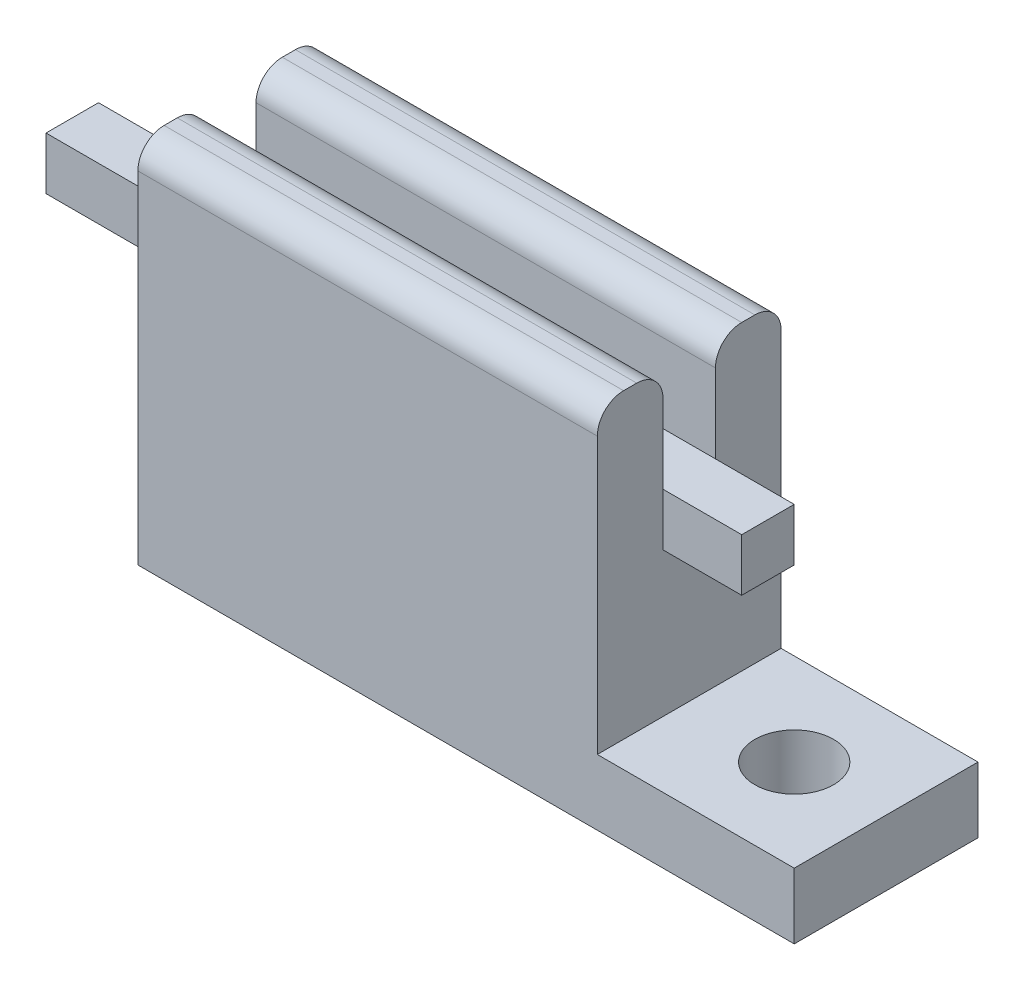
ISO-10303-21;
HEADER;
FILE_DESCRIPTION(('STEP AP214'),'2;1');
FILE_NAME('part.step','',(''),(''),'','','');
FILE_SCHEMA(('AUTOMOTIVE_DESIGN { 1 0 10303 214 1 1 1 1 }'));
ENDSEC;
DATA;
#1=APPLICATION_CONTEXT('core data for automotive mechanical design processes');
#2=APPLICATION_PROTOCOL_DEFINITION('international standard','automotive_design',2000,#1);
#3=PRODUCT_CONTEXT('',#1,'mechanical');
#4=PRODUCT('Part','Part','',(#3));
#5=PRODUCT_RELATED_PRODUCT_CATEGORY('part','',(#4));
#6=PRODUCT_DEFINITION_FORMATION('','',#4);
#7=PRODUCT_DEFINITION_CONTEXT('part definition',#1,'design');
#8=PRODUCT_DEFINITION('design','',#6,#7);
#9=PRODUCT_DEFINITION_SHAPE('','',#8);
#10=(LENGTH_UNIT() NAMED_UNIT(*) SI_UNIT(.MILLI.,.METRE.));
#11=(NAMED_UNIT(*) PLANE_ANGLE_UNIT() SI_UNIT($,.RADIAN.));
#12=(NAMED_UNIT(*) SI_UNIT($,.STERADIAN.) SOLID_ANGLE_UNIT());
#13=UNCERTAINTY_MEASURE_WITH_UNIT(LENGTH_MEASURE(1.E-05),#10,'distance_accuracy_value','');
#14=(GEOMETRIC_REPRESENTATION_CONTEXT(3) GLOBAL_UNCERTAINTY_ASSIGNED_CONTEXT((#13)) GLOBAL_UNIT_ASSIGNED_CONTEXT((#10,
#11,#12)) REPRESENTATION_CONTEXT('',''));
#15=CARTESIAN_POINT('',(0.,0.,0.));
#16=DIRECTION('',(0.,0.,1.));
#17=DIRECTION('',(1.,0.,0.));
#18=AXIS2_PLACEMENT_3D('',#15,#16,#17);
#19=CARTESIAN_POINT('',(-43.,5.,-6.99999999999999));
#20=DIRECTION('',(1.,0.,0.));
#21=DIRECTION('',(0.,0.,-1.));
#22=AXIS2_PLACEMENT_3D('',#19,#20,#21);
#23=PLANE('',#22);
#24=DIRECTION('',(0.,-1.,0.));
#25=VECTOR('',#24,1.);
#26=CARTESIAN_POINT('',(-43.,5.,7.));
#27=LINE('',#26,#25);
#28=CARTESIAN_POINT('',(-43.,26.,7.));
#29=VERTEX_POINT('',#28);
#30=CARTESIAN_POINT('',(-43.,0.,7.));
#31=VERTEX_POINT('',#30);
#32=EDGE_CURVE('E292',#29,#31,#27,.T.);
#33=ORIENTED_EDGE('',*,*,#32,.F.);
#34=CARTESIAN_POINT('',(-43.,26.,5.));
#35=DIRECTION('',(1.,0.,0.));
#36=DIRECTION('',(0.,0.,-1.));
#37=AXIS2_PLACEMENT_3D('',#34,#35,#36);
#38=CIRCLE('',#37,2.);
#39=CARTESIAN_POINT('',(-43.,28.,5.));
#40=VERTEX_POINT('',#39);
#41=EDGE_CURVE('E331',#29,#40,#38,.F.);
#42=ORIENTED_EDGE('',*,*,#41,.T.);
#43=DIRECTION('',(0.,0.,1.));
#44=VECTOR('',#43,1.);
#45=CARTESIAN_POINT('',(-43.,28.,7.));
#46=LINE('',#45,#44);
#47=CARTESIAN_POINT('',(-43.,28.,4.));
#48=VERTEX_POINT('',#47);
#49=EDGE_CURVE('E261',#48,#40,#46,.T.);
#50=ORIENTED_EDGE('',*,*,#49,.F.);
#51=CARTESIAN_POINT('',(-43.,26.,4.));
#52=DIRECTION('',(1.,0.,0.));
#53=DIRECTION('',(0.,0.,-1.));
#54=AXIS2_PLACEMENT_3D('',#51,#52,#53);
#55=CIRCLE('',#54,2.);
#56=CARTESIAN_POINT('',(-43.,26.,2.));
#57=VERTEX_POINT('',#56);
#58=EDGE_CURVE('E50',#48,#57,#55,.F.);
#59=ORIENTED_EDGE('',*,*,#58,.T.);
#60=DIRECTION('',(0.,-1.,0.));
#61=VECTOR('',#60,1.);
#62=CARTESIAN_POINT('',(-43.,28.,2.));
#63=LINE('',#62,#61);
#64=CARTESIAN_POINT('',(-43.,20.,2.));
#65=VERTEX_POINT('',#64);
#66=EDGE_CURVE('E264',#57,#65,#63,.T.);
#67=ORIENTED_EDGE('',*,*,#66,.T.);
#68=DIRECTION('',(0.,1.,0.));
#69=VECTOR('',#68,1.);
#70=CARTESIAN_POINT('',(-43.,16.,2.));
#71=LINE('',#70,#69);
#72=CARTESIAN_POINT('',(-43.,16.,2.));
#73=VERTEX_POINT('',#72);
#74=EDGE_CURVE('E235',#73,#65,#71,.T.);
#75=ORIENTED_EDGE('',*,*,#74,.F.);
#76=DIRECTION('',(0.,0.,-1.));
#77=VECTOR('',#76,1.);
#78=CARTESIAN_POINT('',(-43.,16.,2.));
#79=LINE('',#78,#77);
#80=CARTESIAN_POINT('',(-43.,16.,-1.99999999999999));
#81=VERTEX_POINT('',#80);
#82=EDGE_CURVE('E214',#73,#81,#79,.T.);
#83=ORIENTED_EDGE('',*,*,#82,.T.);
#84=DIRECTION('',(0.,1.,0.));
#85=VECTOR('',#84,1.);
#86=CARTESIAN_POINT('',(-43.,16.,-1.99999999999999));
#87=LINE('',#86,#85);
#88=CARTESIAN_POINT('',(-43.,20.,-1.99999999999999));
#89=VERTEX_POINT('',#88);
#90=EDGE_CURVE('E227',#81,#89,#87,.T.);
#91=ORIENTED_EDGE('',*,*,#90,.T.);
#92=DIRECTION('',(0.,-1.,0.));
#93=VECTOR('',#92,1.);
#94=CARTESIAN_POINT('',(-43.,28.,-1.99999999999999));
#95=LINE('',#94,#93);
#96=CARTESIAN_POINT('',(-43.,26.,-1.99999999999999));
#97=VERTEX_POINT('',#96);
#98=EDGE_CURVE('E255',#97,#89,#95,.T.);
#99=ORIENTED_EDGE('',*,*,#98,.F.);
#100=CARTESIAN_POINT('',(-43.,26.,-3.99999999999999));
#101=DIRECTION('',(1.,0.,0.));
#102=DIRECTION('',(0.,0.,-1.));
#103=AXIS2_PLACEMENT_3D('',#100,#101,#102);
#104=CIRCLE('',#103,2.);
#105=CARTESIAN_POINT('',(-43.,28.,-3.99999999999999));
#106=VERTEX_POINT('',#105);
#107=EDGE_CURVE('E329',#97,#106,#104,.F.);
#108=ORIENTED_EDGE('',*,*,#107,.T.);
#109=DIRECTION('',(0.,0.,1.));
#110=VECTOR('',#109,1.);
#111=CARTESIAN_POINT('',(-43.,28.,-6.99999999999999));
#112=LINE('',#111,#110);
#113=CARTESIAN_POINT('',(-43.,28.,-4.99999999999999));
#114=VERTEX_POINT('',#113);
#115=EDGE_CURVE('E245',#114,#106,#112,.T.);
#116=ORIENTED_EDGE('',*,*,#115,.F.);
#117=CARTESIAN_POINT('',(-43.,26.,-4.99999999999999));
#118=DIRECTION('',(1.,0.,0.));
#119=DIRECTION('',(0.,0.,-1.));
#120=AXIS2_PLACEMENT_3D('',#117,#118,#119);
#121=CIRCLE('',#120,2.);
#122=CARTESIAN_POINT('',(-43.,26.,-6.99999999999999));
#123=VERTEX_POINT('',#122);
#124=EDGE_CURVE('E57',#114,#123,#121,.F.);
#125=ORIENTED_EDGE('',*,*,#124,.T.);
#126=DIRECTION('',(0.,-1.,0.));
#127=VECTOR('',#126,1.);
#128=CARTESIAN_POINT('',(-43.,5.,-6.99999999999999));
#129=LINE('',#128,#127);
#130=CARTESIAN_POINT('',(-43.,0.,-6.99999999999999));
#131=VERTEX_POINT('',#130);
#132=EDGE_CURVE('E303',#123,#131,#129,.T.);
#133=ORIENTED_EDGE('',*,*,#132,.T.);
#134=DIRECTION('',(0.,0.,1.));
#135=VECTOR('',#134,1.);
#136=CARTESIAN_POINT('',(-43.,0.,-6.99999999999999));
#137=LINE('',#136,#135);
#138=EDGE_CURVE('E287',#131,#31,#137,.T.);
#139=ORIENTED_EDGE('',*,*,#138,.T.);
#140=EDGE_LOOP('',(#33,#42,#50,#59,#67,#75,#83,#91,#99,#108,#116,#125,#133,#139));
#141=FACE_BOUND('',#140,.T.);
#142=ADVANCED_FACE('F35',(#141),#23,.F.);
#143=CARTESIAN_POINT('',(0.,20.,0.));
#144=DIRECTION('',(0.,1.,0.));
#145=DIRECTION('',(0.,0.,1.));
#146=AXIS2_PLACEMENT_3D('',#143,#144,#145);
#147=PLANE('',#146);
#148=DIRECTION('',(-1.,0.,0.));
#149=VECTOR('',#148,1.);
#150=CARTESIAN_POINT('',(-43.,20.,2.));
#151=LINE('',#150,#149);
#152=CARTESIAN_POINT('',(-8.,20.,2.));
#153=VERTEX_POINT('',#152);
#154=EDGE_CURVE('E257',#153,#65,#151,.T.);
#155=ORIENTED_EDGE('',*,*,#154,.F.);
#156=DIRECTION('',(1.,0.,0.));
#157=VECTOR('',#156,1.);
#158=CARTESIAN_POINT('',(-2.,20.,2.));
#159=LINE('',#158,#157);
#160=CARTESIAN_POINT('',(-2.,20.,2.));
#161=VERTEX_POINT('',#160);
#162=EDGE_CURVE('E176',#153,#161,#159,.T.);
#163=ORIENTED_EDGE('',*,*,#162,.T.);
#164=DIRECTION('',(0.,0.,-1.));
#165=VECTOR('',#164,1.);
#166=CARTESIAN_POINT('',(-2.,20.,-1.99999999999999));
#167=LINE('',#166,#165);
#168=CARTESIAN_POINT('',(-2.,20.,-1.99999999999999));
#169=VERTEX_POINT('',#168);
#170=EDGE_CURVE('E201',#161,#169,#167,.T.);
#171=ORIENTED_EDGE('',*,*,#170,.T.);
#172=DIRECTION('',(-1.,0.,0.));
#173=VECTOR('',#172,1.);
#174=CARTESIAN_POINT('',(-8.,20.,-1.99999999999999));
#175=LINE('',#174,#173);
#176=CARTESIAN_POINT('',(-8.,20.,-1.99999999999999));
#177=VERTEX_POINT('',#176);
#178=EDGE_CURVE('E198',#169,#177,#175,.T.);
#179=ORIENTED_EDGE('',*,*,#178,.T.);
#180=DIRECTION('',(1.,0.,0.));
#181=VECTOR('',#180,1.);
#182=CARTESIAN_POINT('',(-43.,20.,-1.99999999999999));
#183=LINE('',#182,#181);
#184=EDGE_CURVE('E238',#89,#177,#183,.T.);
#185=ORIENTED_EDGE('',*,*,#184,.F.);
#186=DIRECTION('',(-1.,0.,0.));
#187=VECTOR('',#186,1.);
#188=CARTESIAN_POINT('',(-43.,20.,-1.99999999999999));
#189=LINE('',#188,#187);
#190=CARTESIAN_POINT('',(-55.,20.,-1.99999999999999));
#191=VERTEX_POINT('',#190);
#192=EDGE_CURVE('E210',#89,#191,#189,.T.);
#193=ORIENTED_EDGE('',*,*,#192,.T.);
#194=DIRECTION('',(0.,0.,1.));
#195=VECTOR('',#194,1.);
#196=CARTESIAN_POINT('',(-55.,20.,-1.99999999999999));
#197=LINE('',#196,#195);
#198=CARTESIAN_POINT('',(-55.,20.,2.));
#199=VERTEX_POINT('',#198);
#200=EDGE_CURVE('E230',#191,#199,#197,.T.);
#201=ORIENTED_EDGE('',*,*,#200,.T.);
#202=DIRECTION('',(1.,0.,0.));
#203=VECTOR('',#202,1.);
#204=CARTESIAN_POINT('',(-55.,20.,2.));
#205=LINE('',#204,#203);
#206=EDGE_CURVE('E218',#199,#65,#205,.T.);
#207=ORIENTED_EDGE('',*,*,#206,.T.);
#208=EDGE_LOOP('',(#155,#163,#171,#179,#185,#193,#201,#207));
#209=FACE_BOUND('',#208,.T.);
#210=ADVANCED_FACE('F366',(#209),#147,.T.);
#211=CARTESIAN_POINT('',(0.,5.,0.));
#212=DIRECTION('',(0.,1.,0.));
#213=DIRECTION('',(0.,0.,1.));
#214=AXIS2_PLACEMENT_3D('',#211,#212,#213);
#215=PLANE('',#214);
#216=DIRECTION('',(0.,0.,-1.));
#217=VECTOR('',#216,1.);
#218=CARTESIAN_POINT('',(-8.,5.,7.));
#219=LINE('',#218,#217);
#220=CARTESIAN_POINT('',(-8.,5.,7.));
#221=VERTEX_POINT('',#220);
#222=CARTESIAN_POINT('',(-8.,5.,-7.));
#223=VERTEX_POINT('',#222);
#224=EDGE_CURVE('E270',#221,#223,#219,.T.);
#225=ORIENTED_EDGE('',*,*,#224,.F.);
#226=DIRECTION('',(1.,0.,0.));
#227=VECTOR('',#226,1.);
#228=CARTESIAN_POINT('',(-43.,5.,7.));
#229=LINE('',#228,#227);
#230=CARTESIAN_POINT('',(7.,5.,7.));
#231=VERTEX_POINT('',#230);
#232=EDGE_CURVE('E284',#221,#231,#229,.T.);
#233=ORIENTED_EDGE('',*,*,#232,.T.);
#234=DIRECTION('',(0.,0.,-1.));
#235=VECTOR('',#234,1.);
#236=CARTESIAN_POINT('',(7.,5.,7.));
#237=LINE('',#236,#235);
#238=CARTESIAN_POINT('',(7.,5.,-7.));
#239=VERTEX_POINT('',#238);
#240=EDGE_CURVE('E286',#231,#239,#237,.T.);
#241=ORIENTED_EDGE('',*,*,#240,.T.);
#242=DIRECTION('',(-1.,0.,0.));
#243=VECTOR('',#242,1.);
#244=CARTESIAN_POINT('',(7.,5.,-7.));
#245=LINE('',#244,#243);
#246=EDGE_CURVE('E289',#239,#223,#245,.T.);
#247=ORIENTED_EDGE('',*,*,#246,.T.);
#248=EDGE_LOOP('',(#225,#233,#241,#247));
#249=FACE_BOUND('',#248,.T.);
#250=CARTESIAN_POINT('',(0.,5.,0.));
#251=DIRECTION('',(0.,1.,0.));
#252=DIRECTION('',(0.,0.,1.));
#253=AXIS2_PLACEMENT_3D('',#250,#251,#252);
#254=CIRCLE('',#253,3.);
#255=CARTESIAN_POINT('',(0.,5.,3.));
#256=VERTEX_POINT('',#255);
#257=EDGE_CURVE('E278',#256,#256,#254,.T.);
#258=ORIENTED_EDGE('',*,*,#257,.F.);
#259=EDGE_LOOP('',(#258));
#260=FACE_BOUND('',#259,.T.);
#261=ADVANCED_FACE('F394',(#249,#260),#215,.T.);
#262=CARTESIAN_POINT('',(0.,0.,0.));
#263=DIRECTION('',(0.,1.,0.));
#264=DIRECTION('',(0.,0.,1.));
#265=AXIS2_PLACEMENT_3D('',#262,#263,#264);
#266=PLANE('',#265);
#267=DIRECTION('',(1.,0.,0.));
#268=VECTOR('',#267,1.);
#269=CARTESIAN_POINT('',(-43.,0.,7.));
#270=LINE('',#269,#268);
#271=CARTESIAN_POINT('',(7.,0.,7.));
#272=VERTEX_POINT('',#271);
#273=EDGE_CURVE('E281',#31,#272,#270,.T.);
#274=ORIENTED_EDGE('',*,*,#273,.F.);
#275=ORIENTED_EDGE('',*,*,#138,.F.);
#276=DIRECTION('',(-1.,0.,0.));
#277=VECTOR('',#276,1.);
#278=CARTESIAN_POINT('',(7.,0.,-7.));
#279=LINE('',#278,#277);
#280=CARTESIAN_POINT('',(7.,0.,-7.));
#281=VERTEX_POINT('',#280);
#282=EDGE_CURVE('E297',#281,#131,#279,.T.);
#283=ORIENTED_EDGE('',*,*,#282,.F.);
#284=DIRECTION('',(0.,0.,-1.));
#285=VECTOR('',#284,1.);
#286=CARTESIAN_POINT('',(7.,0.,7.));
#287=LINE('',#286,#285);
#288=EDGE_CURVE('E295',#272,#281,#287,.T.);
#289=ORIENTED_EDGE('',*,*,#288,.F.);
#290=EDGE_LOOP('',(#274,#275,#283,#289));
#291=FACE_BOUND('',#290,.T.);
#292=CARTESIAN_POINT('',(0.,0.,0.));
#293=DIRECTION('',(0.,1.,0.));
#294=DIRECTION('',(0.,0.,1.));
#295=AXIS2_PLACEMENT_3D('',#292,#293,#294);
#296=CIRCLE('',#295,3.);
#297=CARTESIAN_POINT('',(0.,0.,3.));
#298=VERTEX_POINT('',#297);
#299=EDGE_CURVE('E277',#298,#298,#296,.T.);
#300=ORIENTED_EDGE('',*,*,#299,.T.);
#301=EDGE_LOOP('',(#300));
#302=FACE_BOUND('',#301,.T.);
#303=ADVANCED_FACE('F403',(#291,#302),#266,.F.);
#304=CARTESIAN_POINT('',(-43.,5.,7.));
#305=DIRECTION('',(0.,0.,-1.));
#306=DIRECTION('',(-1.,0.,0.));
#307=AXIS2_PLACEMENT_3D('',#304,#305,#306);
#308=PLANE('',#307);
#309=DIRECTION('',(0.,-1.,0.));
#310=VECTOR('',#309,1.);
#311=CARTESIAN_POINT('',(-8.,20.,7.));
#312=LINE('',#311,#310);
#313=CARTESIAN_POINT('',(-8.,26.,7.));
#314=VERTEX_POINT('',#313);
#315=EDGE_CURVE('E275',#314,#221,#312,.T.);
#316=ORIENTED_EDGE('',*,*,#315,.F.);
#317=DIRECTION('',(1.,0.,0.));
#318=VECTOR('',#317,1.);
#319=CARTESIAN_POINT('',(-43.,26.,7.));
#320=LINE('',#319,#318);
#321=EDGE_CURVE('E325',#314,#29,#320,.F.);
#322=ORIENTED_EDGE('',*,*,#321,.T.);
#323=ORIENTED_EDGE('',*,*,#32,.T.);
#324=ORIENTED_EDGE('',*,*,#273,.T.);
#325=DIRECTION('',(0.,-1.,0.));
#326=VECTOR('',#325,1.);
#327=CARTESIAN_POINT('',(7.,5.,7.));
#328=LINE('',#327,#326);
#329=EDGE_CURVE('E308',#231,#272,#328,.T.);
#330=ORIENTED_EDGE('',*,*,#329,.F.);
#331=ORIENTED_EDGE('',*,*,#232,.F.);
#332=EDGE_LOOP('',(#316,#322,#323,#324,#330,#331));
#333=FACE_BOUND('',#332,.T.);
#334=ADVANCED_FACE('F390',(#333),#308,.F.);
#335=CARTESIAN_POINT('',(7.,5.,7.));
#336=DIRECTION('',(-1.,0.,0.));
#337=DIRECTION('',(0.,0.,1.));
#338=AXIS2_PLACEMENT_3D('',#335,#336,#337);
#339=PLANE('',#338);
#340=ORIENTED_EDGE('',*,*,#288,.T.);
#341=DIRECTION('',(0.,-1.,0.));
#342=VECTOR('',#341,1.);
#343=CARTESIAN_POINT('',(7.,5.,-7.));
#344=LINE('',#343,#342);
#345=EDGE_CURVE('E305',#239,#281,#344,.T.);
#346=ORIENTED_EDGE('',*,*,#345,.F.);
#347=ORIENTED_EDGE('',*,*,#240,.F.);
#348=ORIENTED_EDGE('',*,*,#329,.T.);
#349=EDGE_LOOP('',(#340,#346,#347,#348));
#350=FACE_BOUND('',#349,.T.);
#351=ADVANCED_FACE('F398',(#350),#339,.F.);
#352=CARTESIAN_POINT('',(7.,5.,-7.));
#353=DIRECTION('',(0.,0.,1.));
#354=DIRECTION('',(1.,0.,0.));
#355=AXIS2_PLACEMENT_3D('',#352,#353,#354);
#356=PLANE('',#355);
#357=ORIENTED_EDGE('',*,*,#132,.F.);
#358=DIRECTION('',(-1.,0.,0.));
#359=VECTOR('',#358,1.);
#360=CARTESIAN_POINT('',(-8.,26.,-7.));
#361=LINE('',#360,#359);
#362=CARTESIAN_POINT('',(-8.,26.,-7.));
#363=VERTEX_POINT('',#362);
#364=EDGE_CURVE('E43',#123,#363,#361,.F.);
#365=ORIENTED_EDGE('',*,*,#364,.T.);
#366=DIRECTION('',(0.,-1.,0.));
#367=VECTOR('',#366,1.);
#368=CARTESIAN_POINT('',(-8.,20.,-7.));
#369=LINE('',#368,#367);
#370=EDGE_CURVE('E273',#363,#223,#369,.T.);
#371=ORIENTED_EDGE('',*,*,#370,.T.);
#372=ORIENTED_EDGE('',*,*,#246,.F.);
#373=ORIENTED_EDGE('',*,*,#345,.T.);
#374=ORIENTED_EDGE('',*,*,#282,.T.);
#375=EDGE_LOOP('',(#357,#365,#371,#372,#373,#374));
#376=FACE_BOUND('',#375,.T.);
#377=ADVANCED_FACE('F343',(#376),#356,.F.);
#378=CARTESIAN_POINT('',(0.,5.,0.));
#379=DIRECTION('',(0.,-1.,0.));
#380=DIRECTION('',(0.,0.,-1.));
#381=AXIS2_PLACEMENT_3D('',#378,#379,#380);
#382=CYLINDRICAL_SURFACE('',#381,3.);
#383=ORIENTED_EDGE('',*,*,#257,.T.);
#384=EDGE_LOOP('',(#383));
#385=FACE_BOUND('',#384,.T.);
#386=ORIENTED_EDGE('',*,*,#299,.F.);
#387=EDGE_LOOP('',(#386));
#388=FACE_BOUND('',#387,.T.);
#389=ADVANCED_FACE('F409',(#385,#388),#382,.F.);
#390=CARTESIAN_POINT('',(-8.,20.,7.));
#391=DIRECTION('',(-1.,0.,0.));
#392=DIRECTION('',(0.,0.,1.));
#393=AXIS2_PLACEMENT_3D('',#390,#391,#392);
#394=PLANE('',#393);
#395=DIRECTION('',(0.,0.,-1.));
#396=VECTOR('',#395,1.);
#397=CARTESIAN_POINT('',(-8.,28.,2.));
#398=LINE('',#397,#396);
#399=CARTESIAN_POINT('',(-8.,28.,5.));
#400=VERTEX_POINT('',#399);
#401=CARTESIAN_POINT('',(-8.,28.,4.));
#402=VERTEX_POINT('',#401);
#403=EDGE_CURVE('E258',#400,#402,#398,.T.);
#404=ORIENTED_EDGE('',*,*,#403,.F.);
#405=CARTESIAN_POINT('',(-8.,26.,5.));
#406=DIRECTION('',(-1.,0.,0.));
#407=DIRECTION('',(0.,0.,1.));
#408=AXIS2_PLACEMENT_3D('',#405,#406,#407);
#409=CIRCLE('',#408,2.);
#410=EDGE_CURVE('E323',#400,#314,#409,.F.);
#411=ORIENTED_EDGE('',*,*,#410,.T.);
#412=ORIENTED_EDGE('',*,*,#315,.T.);
#413=ORIENTED_EDGE('',*,*,#224,.T.);
#414=ORIENTED_EDGE('',*,*,#370,.F.);
#415=CARTESIAN_POINT('',(-8.,26.,-5.));
#416=DIRECTION('',(-1.,0.,0.));
#417=DIRECTION('',(0.,0.,1.));
#418=AXIS2_PLACEMENT_3D('',#415,#416,#417);
#419=CIRCLE('',#418,2.);
#420=CARTESIAN_POINT('',(-8.,28.,-5.));
#421=VERTEX_POINT('',#420);
#422=EDGE_CURVE('E319',#363,#421,#419,.F.);
#423=ORIENTED_EDGE('',*,*,#422,.T.);
#424=DIRECTION('',(0.,0.,-1.));
#425=VECTOR('',#424,1.);
#426=CARTESIAN_POINT('',(-8.,28.,-1.99999999999999));
#427=LINE('',#426,#425);
#428=CARTESIAN_POINT('',(-8.,28.,-3.99999999999999));
#429=VERTEX_POINT('',#428);
#430=EDGE_CURVE('E248',#429,#421,#427,.T.);
#431=ORIENTED_EDGE('',*,*,#430,.F.);
#432=CARTESIAN_POINT('',(-8.,26.,-3.99999999999999));
#433=DIRECTION('',(-1.,0.,0.));
#434=DIRECTION('',(0.,0.,1.));
#435=AXIS2_PLACEMENT_3D('',#432,#433,#434);
#436=CIRCLE('',#435,2.);
#437=CARTESIAN_POINT('',(-8.,26.,-1.99999999999999));
#438=VERTEX_POINT('',#437);
#439=EDGE_CURVE('E321',#429,#438,#436,.F.);
#440=ORIENTED_EDGE('',*,*,#439,.T.);
#441=DIRECTION('',(0.,-1.,0.));
#442=VECTOR('',#441,1.);
#443=CARTESIAN_POINT('',(-8.,28.,-1.99999999999999));
#444=LINE('',#443,#442);
#445=EDGE_CURVE('E251',#438,#177,#444,.T.);
#446=ORIENTED_EDGE('',*,*,#445,.T.);
#447=DIRECTION('',(0.,1.,0.));
#448=VECTOR('',#447,1.);
#449=CARTESIAN_POINT('',(-8.,16.,-1.99999999999999));
#450=LINE('',#449,#448);
#451=CARTESIAN_POINT('',(-8.,16.,-1.99999999999999));
#452=VERTEX_POINT('',#451);
#453=EDGE_CURVE('E197',#452,#177,#450,.T.);
#454=ORIENTED_EDGE('',*,*,#453,.F.);
#455=DIRECTION('',(0.,0.,1.));
#456=VECTOR('',#455,1.);
#457=CARTESIAN_POINT('',(-8.,16.,2.));
#458=LINE('',#457,#456);
#459=CARTESIAN_POINT('',(-8.,16.,2.));
#460=VERTEX_POINT('',#459);
#461=EDGE_CURVE('E188',#452,#460,#458,.T.);
#462=ORIENTED_EDGE('',*,*,#461,.T.);
#463=DIRECTION('',(0.,1.,0.));
#464=VECTOR('',#463,1.);
#465=CARTESIAN_POINT('',(-8.,16.,2.));
#466=LINE('',#465,#464);
#467=EDGE_CURVE('E171',#460,#153,#466,.T.);
#468=ORIENTED_EDGE('',*,*,#467,.T.);
#469=DIRECTION('',(0.,-1.,0.));
#470=VECTOR('',#469,1.);
#471=CARTESIAN_POINT('',(-8.,28.,2.));
#472=LINE('',#471,#470);
#473=CARTESIAN_POINT('',(-8.,26.,2.));
#474=VERTEX_POINT('',#473);
#475=EDGE_CURVE('E268',#474,#153,#472,.T.);
#476=ORIENTED_EDGE('',*,*,#475,.F.);
#477=CARTESIAN_POINT('',(-8.,26.,4.));
#478=DIRECTION('',(-1.,0.,0.));
#479=DIRECTION('',(0.,0.,1.));
#480=AXIS2_PLACEMENT_3D('',#477,#478,#479);
#481=CIRCLE('',#480,2.);
#482=EDGE_CURVE('E317',#474,#402,#481,.F.);
#483=ORIENTED_EDGE('',*,*,#482,.T.);
#484=EDGE_LOOP('',(#404,#411,#412,#413,#414,#423,#431,#440,#446,#454,#462,#468,#476,#483));
#485=FACE_BOUND('',#484,.T.);
#486=ADVANCED_FACE('F195',(#485),#394,.F.);
#487=CARTESIAN_POINT('',(-43.,28.,2.));
#488=DIRECTION('',(0.,0.,1.));
#489=DIRECTION('',(1.,0.,0.));
#490=AXIS2_PLACEMENT_3D('',#487,#488,#489);
#491=PLANE('',#490);
#492=ORIENTED_EDGE('',*,*,#66,.F.);
#493=DIRECTION('',(-1.,0.,0.));
#494=VECTOR('',#493,1.);
#495=CARTESIAN_POINT('',(-43.,26.,2.));
#496=LINE('',#495,#494);
#497=EDGE_CURVE('E11',#57,#474,#496,.F.);
#498=ORIENTED_EDGE('',*,*,#497,.T.);
#499=ORIENTED_EDGE('',*,*,#475,.T.);
#500=ORIENTED_EDGE('',*,*,#154,.T.);
#501=EDGE_LOOP('',(#492,#498,#499,#500));
#502=FACE_BOUND('',#501,.T.);
#503=ADVANCED_FACE('F375',(#502),#491,.F.);
#504=CARTESIAN_POINT('',(0.,28.,0.));
#505=DIRECTION('',(0.,-1.,0.));
#506=DIRECTION('',(0.,0.,-1.));
#507=AXIS2_PLACEMENT_3D('',#504,#505,#506);
#508=PLANE('',#507);
#509=ORIENTED_EDGE('',*,*,#49,.T.);
#510=DIRECTION('',(1.,0.,0.));
#511=VECTOR('',#510,1.);
#512=CARTESIAN_POINT('',(0.,28.,5.));
#513=LINE('',#512,#511);
#514=EDGE_CURVE('E314',#40,#400,#513,.T.);
#515=ORIENTED_EDGE('',*,*,#514,.T.);
#516=ORIENTED_EDGE('',*,*,#403,.T.);
#517=DIRECTION('',(-1.,0.,0.));
#518=VECTOR('',#517,1.);
#519=CARTESIAN_POINT('',(0.,28.,4.));
#520=LINE('',#519,#518);
#521=EDGE_CURVE('E311',#402,#48,#520,.T.);
#522=ORIENTED_EDGE('',*,*,#521,.T.);
#523=EDGE_LOOP('',(#509,#515,#516,#522));
#524=FACE_BOUND('',#523,.T.);
#525=ADVANCED_FACE('F381',(#524),#508,.F.);
#526=CARTESIAN_POINT('',(-43.,28.,-1.99999999999999));
#527=DIRECTION('',(0.,0.,-1.));
#528=DIRECTION('',(-1.,0.,0.));
#529=AXIS2_PLACEMENT_3D('',#526,#527,#528);
#530=PLANE('',#529);
#531=ORIENTED_EDGE('',*,*,#445,.F.);
#532=DIRECTION('',(1.,0.,0.));
#533=VECTOR('',#532,1.);
#534=CARTESIAN_POINT('',(-43.,26.,-1.99999999999999));
#535=LINE('',#534,#533);
#536=EDGE_CURVE('E339',#438,#97,#535,.F.);
#537=ORIENTED_EDGE('',*,*,#536,.T.);
#538=ORIENTED_EDGE('',*,*,#98,.T.);
#539=ORIENTED_EDGE('',*,*,#184,.T.);
#540=EDGE_LOOP('',(#531,#537,#538,#539));
#541=FACE_BOUND('',#540,.T.);
#542=ADVANCED_FACE('F362',(#541),#530,.F.);
#543=CARTESIAN_POINT('',(0.,28.,0.));
#544=DIRECTION('',(0.,1.,0.));
#545=DIRECTION('',(0.,0.,1.));
#546=AXIS2_PLACEMENT_3D('',#543,#544,#545);
#547=PLANE('',#546);
#548=ORIENTED_EDGE('',*,*,#115,.T.);
#549=DIRECTION('',(1.,0.,0.));
#550=VECTOR('',#549,1.);
#551=CARTESIAN_POINT('',(-8.,28.,-3.99999999999999));
#552=LINE('',#551,#550);
#553=EDGE_CURVE('E336',#106,#429,#552,.T.);
#554=ORIENTED_EDGE('',*,*,#553,.T.);
#555=ORIENTED_EDGE('',*,*,#430,.T.);
#556=DIRECTION('',(-1.,0.,0.));
#557=VECTOR('',#556,1.);
#558=CARTESIAN_POINT('',(-43.,28.,-4.99999999999999));
#559=LINE('',#558,#557);
#560=EDGE_CURVE('E333',#421,#114,#559,.T.);
#561=ORIENTED_EDGE('',*,*,#560,.T.);
#562=EDGE_LOOP('',(#548,#554,#555,#561));
#563=FACE_BOUND('',#562,.T.);
#564=ADVANCED_FACE('F352',(#563),#547,.T.);
#565=CARTESIAN_POINT('',(-55.,16.,2.));
#566=DIRECTION('',(0.,0.,1.));
#567=DIRECTION('',(1.,0.,0.));
#568=AXIS2_PLACEMENT_3D('',#565,#566,#567);
#569=PLANE('',#568);
#570=ORIENTED_EDGE('',*,*,#206,.F.);
#571=DIRECTION('',(0.,1.,0.));
#572=VECTOR('',#571,1.);
#573=CARTESIAN_POINT('',(-55.,16.,2.));
#574=LINE('',#573,#572);
#575=CARTESIAN_POINT('',(-55.,16.,2.));
#576=VERTEX_POINT('',#575);
#577=EDGE_CURVE('E239',#576,#199,#574,.T.);
#578=ORIENTED_EDGE('',*,*,#577,.F.);
#579=DIRECTION('',(1.,0.,0.));
#580=VECTOR('',#579,1.);
#581=CARTESIAN_POINT('',(-55.,16.,2.));
#582=LINE('',#581,#580);
#583=EDGE_CURVE('E224',#576,#73,#582,.T.);
#584=ORIENTED_EDGE('',*,*,#583,.T.);
#585=ORIENTED_EDGE('',*,*,#74,.T.);
#586=EDGE_LOOP('',(#570,#578,#584,#585));
#587=FACE_BOUND('',#586,.T.);
#588=ADVANCED_FACE('F467',(#587),#569,.T.);
#589=CARTESIAN_POINT('',(-55.,16.,-1.99999999999999));
#590=DIRECTION('',(-1.,0.,0.));
#591=DIRECTION('',(0.,0.,1.));
#592=AXIS2_PLACEMENT_3D('',#589,#590,#591);
#593=PLANE('',#592);
#594=ORIENTED_EDGE('',*,*,#200,.F.);
#595=DIRECTION('',(0.,1.,0.));
#596=VECTOR('',#595,1.);
#597=CARTESIAN_POINT('',(-55.,16.,-1.99999999999999));
#598=LINE('',#597,#596);
#599=CARTESIAN_POINT('',(-55.,16.,-1.99999999999999));
#600=VERTEX_POINT('',#599);
#601=EDGE_CURVE('E241',#600,#191,#598,.T.);
#602=ORIENTED_EDGE('',*,*,#601,.F.);
#603=DIRECTION('',(0.,0.,1.));
#604=VECTOR('',#603,1.);
#605=CARTESIAN_POINT('',(-55.,16.,-1.99999999999999));
#606=LINE('',#605,#604);
#607=EDGE_CURVE('E221',#600,#576,#606,.T.);
#608=ORIENTED_EDGE('',*,*,#607,.T.);
#609=ORIENTED_EDGE('',*,*,#577,.T.);
#610=EDGE_LOOP('',(#594,#602,#608,#609));
#611=FACE_BOUND('',#610,.T.);
#612=ADVANCED_FACE('F571',(#611),#593,.T.);
#613=CARTESIAN_POINT('',(-43.,16.,-1.99999999999999));
#614=DIRECTION('',(0.,0.,-1.));
#615=DIRECTION('',(-1.,0.,0.));
#616=AXIS2_PLACEMENT_3D('',#613,#614,#615);
#617=PLANE('',#616);
#618=ORIENTED_EDGE('',*,*,#192,.F.);
#619=ORIENTED_EDGE('',*,*,#90,.F.);
#620=DIRECTION('',(-1.,0.,0.));
#621=VECTOR('',#620,1.);
#622=CARTESIAN_POINT('',(-43.,16.,-1.99999999999999));
#623=LINE('',#622,#621);
#624=EDGE_CURVE('E217',#81,#600,#623,.T.);
#625=ORIENTED_EDGE('',*,*,#624,.T.);
#626=ORIENTED_EDGE('',*,*,#601,.T.);
#627=EDGE_LOOP('',(#618,#619,#625,#626));
#628=FACE_BOUND('',#627,.T.);
#629=ADVANCED_FACE('F561',(#628),#617,.T.);
#630=CARTESIAN_POINT('',(0.,16.,0.));
#631=DIRECTION('',(0.,1.,0.));
#632=DIRECTION('',(0.,0.,1.));
#633=AXIS2_PLACEMENT_3D('',#630,#631,#632);
#634=PLANE('',#633);
#635=ORIENTED_EDGE('',*,*,#82,.F.);
#636=ORIENTED_EDGE('',*,*,#583,.F.);
#637=ORIENTED_EDGE('',*,*,#607,.F.);
#638=ORIENTED_EDGE('',*,*,#624,.F.);
#639=EDGE_LOOP('',(#635,#636,#637,#638));
#640=FACE_BOUND('',#639,.T.);
#641=ADVANCED_FACE('F552',(#640),#634,.F.);
#642=CARTESIAN_POINT('',(-8.,16.,-1.99999999999999));
#643=DIRECTION('',(0.,0.,-1.));
#644=DIRECTION('',(-1.,0.,0.));
#645=AXIS2_PLACEMENT_3D('',#642,#643,#644);
#646=PLANE('',#645);
#647=ORIENTED_EDGE('',*,*,#178,.F.);
#648=DIRECTION('',(0.,1.,0.));
#649=VECTOR('',#648,1.);
#650=CARTESIAN_POINT('',(-2.,16.,-1.99999999999999));
#651=LINE('',#650,#649);
#652=CARTESIAN_POINT('',(-2.,16.,-1.99999999999999));
#653=VERTEX_POINT('',#652);
#654=EDGE_CURVE('E211',#653,#169,#651,.T.);
#655=ORIENTED_EDGE('',*,*,#654,.F.);
#656=DIRECTION('',(-1.,0.,0.));
#657=VECTOR('',#656,1.);
#658=CARTESIAN_POINT('',(-8.,16.,-1.99999999999999));
#659=LINE('',#658,#657);
#660=EDGE_CURVE('E182',#653,#452,#659,.T.);
#661=ORIENTED_EDGE('',*,*,#660,.T.);
#662=ORIENTED_EDGE('',*,*,#453,.T.);
#663=EDGE_LOOP('',(#647,#655,#661,#662));
#664=FACE_BOUND('',#663,.T.);
#665=ADVANCED_FACE('F370',(#664),#646,.T.);
#666=CARTESIAN_POINT('',(-2.,16.,-1.99999999999999));
#667=DIRECTION('',(1.,0.,0.));
#668=DIRECTION('',(0.,0.,-1.));
#669=AXIS2_PLACEMENT_3D('',#666,#667,#668);
#670=PLANE('',#669);
#671=ORIENTED_EDGE('',*,*,#170,.F.);
#672=DIRECTION('',(0.,1.,0.));
#673=VECTOR('',#672,1.);
#674=CARTESIAN_POINT('',(-2.,16.,2.));
#675=LINE('',#674,#673);
#676=CARTESIAN_POINT('',(-2.,16.,2.));
#677=VERTEX_POINT('',#676);
#678=EDGE_CURVE('E181',#677,#161,#675,.T.);
#679=ORIENTED_EDGE('',*,*,#678,.F.);
#680=DIRECTION('',(0.,0.,-1.));
#681=VECTOR('',#680,1.);
#682=CARTESIAN_POINT('',(-2.,16.,-1.99999999999999));
#683=LINE('',#682,#681);
#684=EDGE_CURVE('E191',#677,#653,#683,.T.);
#685=ORIENTED_EDGE('',*,*,#684,.T.);
#686=ORIENTED_EDGE('',*,*,#654,.T.);
#687=EDGE_LOOP('',(#671,#679,#685,#686));
#688=FACE_BOUND('',#687,.T.);
#689=ADVANCED_FACE('F372',(#688),#670,.T.);
#690=CARTESIAN_POINT('',(-2.,16.,2.));
#691=DIRECTION('',(0.,0.,1.));
#692=DIRECTION('',(1.,0.,0.));
#693=AXIS2_PLACEMENT_3D('',#690,#691,#692);
#694=PLANE('',#693);
#695=ORIENTED_EDGE('',*,*,#162,.F.);
#696=ORIENTED_EDGE('',*,*,#467,.F.);
#697=DIRECTION('',(1.,0.,0.));
#698=VECTOR('',#697,1.);
#699=CARTESIAN_POINT('',(-2.,16.,2.));
#700=LINE('',#699,#698);
#701=EDGE_CURVE('E174',#460,#677,#700,.T.);
#702=ORIENTED_EDGE('',*,*,#701,.T.);
#703=ORIENTED_EDGE('',*,*,#678,.T.);
#704=EDGE_LOOP('',(#695,#696,#702,#703));
#705=FACE_BOUND('',#704,.T.);
#706=ADVANCED_FACE('F173',(#705),#694,.T.);
#707=CARTESIAN_POINT('',(0.,16.,0.));
#708=DIRECTION('',(0.,-1.,0.));
#709=DIRECTION('',(0.,0.,-1.));
#710=AXIS2_PLACEMENT_3D('',#707,#708,#709);
#711=PLANE('',#710);
#712=ORIENTED_EDGE('',*,*,#461,.F.);
#713=ORIENTED_EDGE('',*,*,#660,.F.);
#714=ORIENTED_EDGE('',*,*,#684,.F.);
#715=ORIENTED_EDGE('',*,*,#701,.F.);
#716=EDGE_LOOP('',(#712,#713,#714,#715));
#717=FACE_BOUND('',#716,.T.);
#718=ADVANCED_FACE('F186',(#717),#711,.T.);
#719=CARTESIAN_POINT('',(0.,26.,5.));
#720=DIRECTION('',(1.,0.,0.));
#721=DIRECTION('',(0.,0.,-1.));
#722=AXIS2_PLACEMENT_3D('',#719,#720,#721);
#723=CYLINDRICAL_SURFACE('',#722,2.);
#724=ORIENTED_EDGE('',*,*,#41,.F.);
#725=ORIENTED_EDGE('',*,*,#321,.F.);
#726=ORIENTED_EDGE('',*,*,#410,.F.);
#727=ORIENTED_EDGE('',*,*,#514,.F.);
#728=EDGE_LOOP('',(#724,#725,#726,#727));
#729=FACE_BOUND('',#728,.T.);
#730=ADVANCED_FACE('F386',(#729),#723,.T.);
#731=CARTESIAN_POINT('',(0.,26.,-3.99999999999999));
#732=DIRECTION('',(-1.,0.,0.));
#733=DIRECTION('',(0.,0.,1.));
#734=AXIS2_PLACEMENT_3D('',#731,#732,#733);
#735=CYLINDRICAL_SURFACE('',#734,2.);
#736=ORIENTED_EDGE('',*,*,#107,.F.);
#737=ORIENTED_EDGE('',*,*,#536,.F.);
#738=ORIENTED_EDGE('',*,*,#439,.F.);
#739=ORIENTED_EDGE('',*,*,#553,.F.);
#740=EDGE_LOOP('',(#736,#737,#738,#739));
#741=FACE_BOUND('',#740,.T.);
#742=ADVANCED_FACE('F359',(#741),#735,.T.);
#743=CARTESIAN_POINT('',(0.,26.,-5.));
#744=DIRECTION('',(1.,0.,0.));
#745=DIRECTION('',(0.,0.,-1.));
#746=AXIS2_PLACEMENT_3D('',#743,#744,#745);
#747=CYLINDRICAL_SURFACE('',#746,2.);
#748=ORIENTED_EDGE('',*,*,#422,.F.);
#749=ORIENTED_EDGE('',*,*,#364,.F.);
#750=ORIENTED_EDGE('',*,*,#124,.F.);
#751=ORIENTED_EDGE('',*,*,#560,.F.);
#752=EDGE_LOOP('',(#748,#749,#750,#751));
#753=FACE_BOUND('',#752,.T.);
#754=ADVANCED_FACE('F350',(#753),#747,.T.);
#755=CARTESIAN_POINT('',(0.,26.,4.));
#756=DIRECTION('',(-1.,0.,0.));
#757=DIRECTION('',(0.,0.,1.));
#758=AXIS2_PLACEMENT_3D('',#755,#756,#757);
#759=CYLINDRICAL_SURFACE('',#758,2.);
#760=ORIENTED_EDGE('',*,*,#482,.F.);
#761=ORIENTED_EDGE('',*,*,#497,.F.);
#762=ORIENTED_EDGE('',*,*,#58,.F.);
#763=ORIENTED_EDGE('',*,*,#521,.F.);
#764=EDGE_LOOP('',(#760,#761,#762,#763));
#765=FACE_BOUND('',#764,.T.);
#766=ADVANCED_FACE('F37',(#765),#759,.T.);
#767=CLOSED_SHELL('',(#142,#210,#261,#303,#334,#351,#377,#389,#486,#503,#525,#542,#564,#588,
#612,#629,#641,#665,#689,#706,#718,#730,#742,#754,#766));
#768=MANIFOLD_SOLID_BREP('B2',#767);
#769=ADVANCED_BREP_SHAPE_REPRESENTATION('',(#18,#768),#14);
#770=SHAPE_DEFINITION_REPRESENTATION(#9,#769);
ENDSEC;
END-ISO-10303-21;
